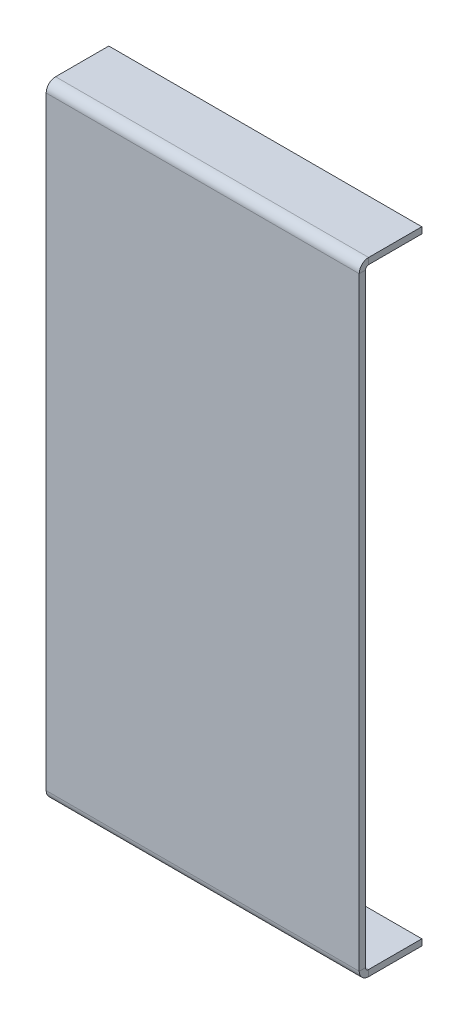
ISO-10303-21;
HEADER;
FILE_DESCRIPTION(('STEP AP214'),'2;1');
FILE_NAME('part.step','',(''),(''),'','','');
FILE_SCHEMA(('AUTOMOTIVE_DESIGN { 1 0 10303 214 1 1 1 1 }'));
ENDSEC;
DATA;
#1=APPLICATION_CONTEXT('core data for automotive mechanical design processes');
#2=APPLICATION_PROTOCOL_DEFINITION('international standard','automotive_design',2000,#1);
#3=PRODUCT_CONTEXT('',#1,'mechanical');
#4=PRODUCT('Part','Part','',(#3));
#5=PRODUCT_RELATED_PRODUCT_CATEGORY('part','',(#4));
#6=PRODUCT_DEFINITION_FORMATION('','',#4);
#7=PRODUCT_DEFINITION_CONTEXT('part definition',#1,'design');
#8=PRODUCT_DEFINITION('design','',#6,#7);
#9=PRODUCT_DEFINITION_SHAPE('','',#8);
#10=(LENGTH_UNIT() NAMED_UNIT(*) SI_UNIT(.MILLI.,.METRE.));
#11=(NAMED_UNIT(*) PLANE_ANGLE_UNIT() SI_UNIT($,.RADIAN.));
#12=(NAMED_UNIT(*) SI_UNIT($,.STERADIAN.) SOLID_ANGLE_UNIT());
#13=UNCERTAINTY_MEASURE_WITH_UNIT(LENGTH_MEASURE(1.E-05),#10,'distance_accuracy_value','');
#14=(GEOMETRIC_REPRESENTATION_CONTEXT(3) GLOBAL_UNCERTAINTY_ASSIGNED_CONTEXT((#13)) GLOBAL_UNIT_ASSIGNED_CONTEXT((#10,
#11,#12)) REPRESENTATION_CONTEXT('',''));
#15=CARTESIAN_POINT('',(0.,0.,0.));
#16=DIRECTION('',(0.,0.,1.));
#17=DIRECTION('',(1.,0.,0.));
#18=AXIS2_PLACEMENT_3D('',#15,#16,#17);
#19=CARTESIAN_POINT('',(0.,0.,-2.));
#20=DIRECTION('',(0.,0.,1.));
#21=DIRECTION('',(1.,0.,0.));
#22=AXIS2_PLACEMENT_3D('',#19,#20,#21);
#23=PLANE('',#22);
#24=DIRECTION('',(-1.,0.,0.));
#25=VECTOR('',#24,1.);
#26=CARTESIAN_POINT('',(-50.,-96.5,-2.00000000000001));
#27=LINE('',#26,#25);
#28=CARTESIAN_POINT('',(-50.,-96.5,-2.00000000000001));
#29=VERTEX_POINT('',#28);
#30=CARTESIAN_POINT('',(50.,-96.5,-2.00000000000001));
#31=VERTEX_POINT('',#30);
#32=EDGE_CURVE('E225',#29,#31,#27,.F.);
#33=ORIENTED_EDGE('',*,*,#32,.F.);
#34=DIRECTION('',(0.,-1.,0.));
#35=VECTOR('',#34,1.);
#36=CARTESIAN_POINT('',(-50.,99.5,-2.));
#37=LINE('',#36,#35);
#38=CARTESIAN_POINT('',(-50.,96.5,-2.00000000000001));
#39=VERTEX_POINT('',#38);
#40=EDGE_CURVE('E13',#39,#29,#37,.T.);
#41=ORIENTED_EDGE('',*,*,#40,.F.);
#42=DIRECTION('',(1.,0.,0.));
#43=VECTOR('',#42,1.);
#44=CARTESIAN_POINT('',(50.,96.5,-2.00000000000001));
#45=LINE('',#44,#43);
#46=CARTESIAN_POINT('',(50.,96.5,-2.00000000000001));
#47=VERTEX_POINT('',#46);
#48=EDGE_CURVE('E277',#47,#39,#45,.F.);
#49=ORIENTED_EDGE('',*,*,#48,.F.);
#50=DIRECTION('',(0.,1.,0.));
#51=VECTOR('',#50,1.);
#52=CARTESIAN_POINT('',(50.,99.5,-2.));
#53=LINE('',#52,#51);
#54=EDGE_CURVE('E88',#31,#47,#53,.T.);
#55=ORIENTED_EDGE('',*,*,#54,.F.);
#56=EDGE_LOOP('',(#33,#41,#49,#55));
#57=FACE_BOUND('',#56,.T.);
#58=ADVANCED_FACE('F79',(#57),#23,.F.);
#59=CARTESIAN_POINT('',(0.,0.,0.));
#60=DIRECTION('',(0.,0.,1.));
#61=DIRECTION('',(1.,0.,0.));
#62=AXIS2_PLACEMENT_3D('',#59,#60,#61);
#63=PLANE('',#62);
#64=DIRECTION('',(0.,-1.,0.));
#65=VECTOR('',#64,1.);
#66=CARTESIAN_POINT('',(-50.,99.5,0.));
#67=LINE('',#66,#65);
#68=CARTESIAN_POINT('',(-50.,96.5,0.));
#69=VERTEX_POINT('',#68);
#70=CARTESIAN_POINT('',(-50.,-96.5,0.));
#71=VERTEX_POINT('',#70);
#72=EDGE_CURVE('E83',#69,#71,#67,.T.);
#73=ORIENTED_EDGE('',*,*,#72,.T.);
#74=DIRECTION('',(-1.,0.,0.));
#75=VECTOR('',#74,1.);
#76=CARTESIAN_POINT('',(-50.,-96.5,0.));
#77=LINE('',#76,#75);
#78=CARTESIAN_POINT('',(50.,-96.5,0.));
#79=VERTEX_POINT('',#78);
#80=EDGE_CURVE('E214',#71,#79,#77,.F.);
#81=ORIENTED_EDGE('',*,*,#80,.T.);
#82=DIRECTION('',(0.,1.,0.));
#83=VECTOR('',#82,1.);
#84=CARTESIAN_POINT('',(50.,99.5,0.));
#85=LINE('',#84,#83);
#86=CARTESIAN_POINT('',(50.,96.5,0.));
#87=VERTEX_POINT('',#86);
#88=EDGE_CURVE('E283',#79,#87,#85,.T.);
#89=ORIENTED_EDGE('',*,*,#88,.T.);
#90=DIRECTION('',(1.,0.,0.));
#91=VECTOR('',#90,1.);
#92=CARTESIAN_POINT('',(50.,96.5,0.));
#93=LINE('',#92,#91);
#94=EDGE_CURVE('E266',#87,#69,#93,.F.);
#95=ORIENTED_EDGE('',*,*,#94,.T.);
#96=EDGE_LOOP('',(#73,#81,#89,#95));
#97=FACE_BOUND('',#96,.T.);
#98=ADVANCED_FACE('F292',(#97),#63,.T.);
#99=CARTESIAN_POINT('',(-50.,99.5,-2.));
#100=DIRECTION('',(-1.,0.,0.));
#101=DIRECTION('',(0.,-1.,0.));
#102=AXIS2_PLACEMENT_3D('',#99,#100,#101);
#103=PLANE('',#102);
#104=ORIENTED_EDGE('',*,*,#40,.T.);
#105=DIRECTION('',(0.,0.,1.));
#106=VECTOR('',#105,1.);
#107=CARTESIAN_POINT('',(-50.,-96.5,-2.00000000000001));
#108=LINE('',#107,#106);
#109=EDGE_CURVE('E219',#29,#71,#108,.T.);
#110=ORIENTED_EDGE('',*,*,#109,.T.);
#111=ORIENTED_EDGE('',*,*,#72,.F.);
#112=DIRECTION('',(0.,0.,1.));
#113=VECTOR('',#112,1.);
#114=CARTESIAN_POINT('',(-50.,96.5,-2.00000000000001));
#115=LINE('',#114,#113);
#116=EDGE_CURVE('E281',#39,#69,#115,.T.);
#117=ORIENTED_EDGE('',*,*,#116,.F.);
#118=EDGE_LOOP('',(#104,#110,#111,#117));
#119=FACE_BOUND('',#118,.T.);
#120=ADVANCED_FACE('F295',(#119),#103,.T.);
#121=CARTESIAN_POINT('',(50.,99.5,-2.));
#122=DIRECTION('',(1.,0.,0.));
#123=DIRECTION('',(0.,1.,0.));
#124=AXIS2_PLACEMENT_3D('',#121,#122,#123);
#125=PLANE('',#124);
#126=DIRECTION('',(0.,0.,1.));
#127=VECTOR('',#126,1.);
#128=CARTESIAN_POINT('',(50.,-96.5,-2.00000000000001));
#129=LINE('',#128,#127);
#130=EDGE_CURVE('E229',#31,#79,#129,.T.);
#131=ORIENTED_EDGE('',*,*,#130,.F.);
#132=ORIENTED_EDGE('',*,*,#54,.T.);
#133=DIRECTION('',(0.,0.,1.));
#134=VECTOR('',#133,1.);
#135=CARTESIAN_POINT('',(50.,96.5,-2.00000000000001));
#136=LINE('',#135,#134);
#137=EDGE_CURVE('E271',#47,#87,#136,.T.);
#138=ORIENTED_EDGE('',*,*,#137,.T.);
#139=ORIENTED_EDGE('',*,*,#88,.F.);
#140=EDGE_LOOP('',(#131,#132,#138,#139));
#141=FACE_BOUND('',#140,.T.);
#142=ADVANCED_FACE('F81',(#141),#125,.T.);
#143=CARTESIAN_POINT('',(-50.,96.5,-3.00000000000001));
#144=DIRECTION('',(-1.,0.,0.));
#145=DIRECTION('',(0.,0.,1.));
#146=AXIS2_PLACEMENT_3D('',#143,#144,#145);
#147=PLANE('',#146);
#148=DIRECTION('',(0.,1.,0.));
#149=VECTOR('',#148,1.);
#150=CARTESIAN_POINT('',(-50.,99.5,-3.));
#151=LINE('',#150,#149);
#152=CARTESIAN_POINT('',(-50.,97.5,-3.));
#153=VERTEX_POINT('',#152);
#154=CARTESIAN_POINT('',(-50.,99.5,-2.99999999999999));
#155=VERTEX_POINT('',#154);
#156=EDGE_CURVE('E231',#153,#155,#151,.T.);
#157=ORIENTED_EDGE('',*,*,#156,.F.);
#158=CARTESIAN_POINT('',(-50.,96.5,-3.00000000000001));
#159=DIRECTION('',(1.,0.,0.));
#160=DIRECTION('',(0.,0.,-1.));
#161=AXIS2_PLACEMENT_3D('',#158,#159,#160);
#162=CIRCLE('',#161,1.);
#163=EDGE_CURVE('E274',#39,#153,#162,.F.);
#164=ORIENTED_EDGE('',*,*,#163,.F.);
#165=ORIENTED_EDGE('',*,*,#116,.T.);
#166=CARTESIAN_POINT('',(-50.,96.5,-3.00000000000001));
#167=DIRECTION('',(1.,0.,0.));
#168=DIRECTION('',(0.,0.,-1.));
#169=AXIS2_PLACEMENT_3D('',#166,#167,#168);
#170=CIRCLE('',#169,3.);
#171=EDGE_CURVE('E96',#69,#155,#170,.F.);
#172=ORIENTED_EDGE('',*,*,#171,.T.);
#173=EDGE_LOOP('',(#157,#164,#165,#172));
#174=FACE_BOUND('',#173,.T.);
#175=ADVANCED_FACE('F341',(#174),#147,.T.);
#176=CARTESIAN_POINT('',(50.,96.5,-3.00000000000001));
#177=DIRECTION('',(-1.,0.,0.));
#178=DIRECTION('',(0.,0.,1.));
#179=AXIS2_PLACEMENT_3D('',#176,#177,#178);
#180=PLANE('',#179);
#181=CARTESIAN_POINT('',(50.,96.5,-3.00000000000001));
#182=DIRECTION('',(1.,0.,0.));
#183=DIRECTION('',(0.,0.,-1.));
#184=AXIS2_PLACEMENT_3D('',#181,#182,#183);
#185=CIRCLE('',#184,1.);
#186=CARTESIAN_POINT('',(50.,97.5,-3.));
#187=VERTEX_POINT('',#186);
#188=EDGE_CURVE('E236',#187,#47,#185,.T.);
#189=ORIENTED_EDGE('',*,*,#188,.F.);
#190=DIRECTION('',(0.,1.,0.));
#191=VECTOR('',#190,1.);
#192=CARTESIAN_POINT('',(50.,97.5,-3.));
#193=LINE('',#192,#191);
#194=CARTESIAN_POINT('',(50.,99.5,-2.99999999999999));
#195=VERTEX_POINT('',#194);
#196=EDGE_CURVE('E259',#187,#195,#193,.T.);
#197=ORIENTED_EDGE('',*,*,#196,.T.);
#198=CARTESIAN_POINT('',(50.,96.5,-3.00000000000001));
#199=DIRECTION('',(1.,0.,0.));
#200=DIRECTION('',(0.,0.,-1.));
#201=AXIS2_PLACEMENT_3D('',#198,#199,#200);
#202=CIRCLE('',#201,3.);
#203=EDGE_CURVE('E269',#195,#87,#202,.T.);
#204=ORIENTED_EDGE('',*,*,#203,.T.);
#205=ORIENTED_EDGE('',*,*,#137,.F.);
#206=EDGE_LOOP('',(#189,#197,#204,#205));
#207=FACE_BOUND('',#206,.T.);
#208=ADVANCED_FACE('F335',(#207),#180,.F.);
#209=CARTESIAN_POINT('',(50.,96.5,-3.00000000000001));
#210=DIRECTION('',(1.,0.,0.));
#211=DIRECTION('',(0.,1.,0.));
#212=AXIS2_PLACEMENT_3D('',#209,#210,#211);
#213=CYLINDRICAL_SURFACE('',#212,3.);
#214=ORIENTED_EDGE('',*,*,#94,.F.);
#215=ORIENTED_EDGE('',*,*,#203,.F.);
#216=DIRECTION('',(1.,0.,0.));
#217=VECTOR('',#216,1.);
#218=CARTESIAN_POINT('',(0.,99.5,-2.99999999999999));
#219=LINE('',#218,#217);
#220=EDGE_CURVE('E256',#155,#195,#219,.T.);
#221=ORIENTED_EDGE('',*,*,#220,.F.);
#222=ORIENTED_EDGE('',*,*,#171,.F.);
#223=EDGE_LOOP('',(#214,#215,#221,#222));
#224=FACE_BOUND('',#223,.T.);
#225=ADVANCED_FACE('F349',(#224),#213,.T.);
#226=CARTESIAN_POINT('',(50.,96.5,-3.00000000000001));
#227=DIRECTION('',(1.,0.,0.));
#228=DIRECTION('',(0.,1.,0.));
#229=AXIS2_PLACEMENT_3D('',#226,#227,#228);
#230=CYLINDRICAL_SURFACE('',#229,1.);
#231=ORIENTED_EDGE('',*,*,#48,.T.);
#232=ORIENTED_EDGE('',*,*,#163,.T.);
#233=DIRECTION('',(-1.,0.,0.));
#234=VECTOR('',#233,1.);
#235=CARTESIAN_POINT('',(-50.,97.5,-3.));
#236=LINE('',#235,#234);
#237=EDGE_CURVE('E262',#153,#187,#236,.F.);
#238=ORIENTED_EDGE('',*,*,#237,.T.);
#239=ORIENTED_EDGE('',*,*,#188,.T.);
#240=EDGE_LOOP('',(#231,#232,#238,#239));
#241=FACE_BOUND('',#240,.T.);
#242=ADVANCED_FACE('F352',(#241),#230,.F.);
#243=CARTESIAN_POINT('',(50.,99.5,-1.99999999999999));
#244=DIRECTION('',(1.,0.,0.));
#245=DIRECTION('',(0.,0.,-1.));
#246=AXIS2_PLACEMENT_3D('',#243,#244,#245);
#247=PLANE('',#246);
#248=DIRECTION('',(0.,0.,1.));
#249=VECTOR('',#248,1.);
#250=CARTESIAN_POINT('',(50.,99.5,-1.99999999999999));
#251=LINE('',#250,#249);
#252=CARTESIAN_POINT('',(50.,99.5000000000001,-20.));
#253=VERTEX_POINT('',#252);
#254=EDGE_CURVE('E240',#253,#195,#251,.T.);
#255=ORIENTED_EDGE('',*,*,#254,.T.);
#256=ORIENTED_EDGE('',*,*,#196,.F.);
#257=DIRECTION('',(0.,0.,-1.));
#258=VECTOR('',#257,1.);
#259=CARTESIAN_POINT('',(50.,97.5,3.83566635243761E-13));
#260=LINE('',#259,#258);
#261=CARTESIAN_POINT('',(50.,97.5000000000001,-20.));
#262=VERTEX_POINT('',#261);
#263=EDGE_CURVE('E248',#262,#187,#260,.F.);
#264=ORIENTED_EDGE('',*,*,#263,.F.);
#265=DIRECTION('',(0.,-1.,0.));
#266=VECTOR('',#265,1.);
#267=CARTESIAN_POINT('',(50.,99.5000000000001,-20.));
#268=LINE('',#267,#266);
#269=EDGE_CURVE('E234',#253,#262,#268,.T.);
#270=ORIENTED_EDGE('',*,*,#269,.F.);
#271=EDGE_LOOP('',(#255,#256,#264,#270));
#272=FACE_BOUND('',#271,.T.);
#273=ADVANCED_FACE('F355',(#272),#247,.T.);
#274=CARTESIAN_POINT('',(-50.,99.5000000000001,-20.));
#275=DIRECTION('',(-1.,0.,0.));
#276=DIRECTION('',(0.,0.,1.));
#277=AXIS2_PLACEMENT_3D('',#274,#275,#276);
#278=PLANE('',#277);
#279=DIRECTION('',(0.,0.,1.));
#280=VECTOR('',#279,1.);
#281=CARTESIAN_POINT('',(-50.,97.5,3.83566635243761E-13));
#282=LINE('',#281,#280);
#283=CARTESIAN_POINT('',(-50.,97.5000000000001,-20.));
#284=VERTEX_POINT('',#283);
#285=EDGE_CURVE('E254',#153,#284,#282,.F.);
#286=ORIENTED_EDGE('',*,*,#285,.F.);
#287=ORIENTED_EDGE('',*,*,#156,.T.);
#288=DIRECTION('',(0.,0.,-1.));
#289=VECTOR('',#288,1.);
#290=CARTESIAN_POINT('',(-50.,99.5000000000001,-20.));
#291=LINE('',#290,#289);
#292=CARTESIAN_POINT('',(-50.,99.5000000000001,-20.));
#293=VERTEX_POINT('',#292);
#294=EDGE_CURVE('E246',#155,#293,#291,.T.);
#295=ORIENTED_EDGE('',*,*,#294,.T.);
#296=DIRECTION('',(0.,-1.,0.));
#297=VECTOR('',#296,1.);
#298=CARTESIAN_POINT('',(-50.,99.5000000000001,-20.));
#299=LINE('',#298,#297);
#300=EDGE_CURVE('E237',#293,#284,#299,.T.);
#301=ORIENTED_EDGE('',*,*,#300,.T.);
#302=EDGE_LOOP('',(#286,#287,#295,#301));
#303=FACE_BOUND('',#302,.T.);
#304=ADVANCED_FACE('F359',(#303),#278,.T.);
#305=CARTESIAN_POINT('',(0.,99.5,3.90549597921447E-13));
#306=DIRECTION('',(0.,1.,0.));
#307=DIRECTION('',(0.,0.,1.));
#308=AXIS2_PLACEMENT_3D('',#305,#306,#307);
#309=PLANE('',#308);
#310=ORIENTED_EDGE('',*,*,#294,.F.);
#311=ORIENTED_EDGE('',*,*,#220,.T.);
#312=ORIENTED_EDGE('',*,*,#254,.F.);
#313=DIRECTION('',(1.,0.,0.));
#314=VECTOR('',#313,1.);
#315=CARTESIAN_POINT('',(50.,99.5000000000001,-20.));
#316=LINE('',#315,#314);
#317=EDGE_CURVE('E243',#293,#253,#316,.T.);
#318=ORIENTED_EDGE('',*,*,#317,.F.);
#319=EDGE_LOOP('',(#310,#311,#312,#318));
#320=FACE_BOUND('',#319,.T.);
#321=ADVANCED_FACE('F362',(#320),#309,.T.);
#322=CARTESIAN_POINT('',(0.,97.5,3.83566635243761E-13));
#323=DIRECTION('',(0.,1.,0.));
#324=DIRECTION('',(0.,0.,1.));
#325=AXIS2_PLACEMENT_3D('',#322,#323,#324);
#326=PLANE('',#325);
#327=ORIENTED_EDGE('',*,*,#237,.F.);
#328=ORIENTED_EDGE('',*,*,#285,.T.);
#329=DIRECTION('',(-1.,0.,0.));
#330=VECTOR('',#329,1.);
#331=CARTESIAN_POINT('',(0.,97.5000000000001,-20.));
#332=LINE('',#331,#330);
#333=EDGE_CURVE('E251',#284,#262,#332,.F.);
#334=ORIENTED_EDGE('',*,*,#333,.T.);
#335=ORIENTED_EDGE('',*,*,#263,.T.);
#336=EDGE_LOOP('',(#327,#328,#334,#335));
#337=FACE_BOUND('',#336,.T.);
#338=ADVANCED_FACE('F367',(#337),#326,.F.);
#339=CARTESIAN_POINT('',(50.,99.5000000000001,-20.));
#340=DIRECTION('',(0.,0.,-1.));
#341=DIRECTION('',(0.,1.,0.));
#342=AXIS2_PLACEMENT_3D('',#339,#340,#341);
#343=PLANE('',#342);
#344=ORIENTED_EDGE('',*,*,#333,.F.);
#345=ORIENTED_EDGE('',*,*,#300,.F.);
#346=ORIENTED_EDGE('',*,*,#317,.T.);
#347=ORIENTED_EDGE('',*,*,#269,.T.);
#348=EDGE_LOOP('',(#344,#345,#346,#347));
#349=FACE_BOUND('',#348,.T.);
#350=ADVANCED_FACE('F364',(#349),#343,.T.);
#351=CARTESIAN_POINT('',(50.,-96.5,-3.00000000000001));
#352=DIRECTION('',(1.,0.,0.));
#353=DIRECTION('',(0.,0.,-1.));
#354=AXIS2_PLACEMENT_3D('',#351,#352,#353);
#355=PLANE('',#354);
#356=DIRECTION('',(0.,-1.,0.));
#357=VECTOR('',#356,1.);
#358=CARTESIAN_POINT('',(50.,-99.5,-2.99999999999999));
#359=LINE('',#358,#357);
#360=CARTESIAN_POINT('',(50.,-97.5,-3.));
#361=VERTEX_POINT('',#360);
#362=CARTESIAN_POINT('',(50.,-99.5,-2.99999999999999));
#363=VERTEX_POINT('',#362);
#364=EDGE_CURVE('E211',#361,#363,#359,.T.);
#365=ORIENTED_EDGE('',*,*,#364,.F.);
#366=CARTESIAN_POINT('',(50.,-96.5,-3.00000000000001));
#367=DIRECTION('',(-1.,0.,0.));
#368=DIRECTION('',(0.,0.,1.));
#369=AXIS2_PLACEMENT_3D('',#366,#367,#368);
#370=CIRCLE('',#369,1.);
#371=EDGE_CURVE('E222',#31,#361,#370,.F.);
#372=ORIENTED_EDGE('',*,*,#371,.F.);
#373=ORIENTED_EDGE('',*,*,#130,.T.);
#374=CARTESIAN_POINT('',(50.,-96.5,-3.00000000000001));
#375=DIRECTION('',(-1.,0.,0.));
#376=DIRECTION('',(0.,0.,1.));
#377=AXIS2_PLACEMENT_3D('',#374,#375,#376);
#378=CIRCLE('',#377,3.);
#379=EDGE_CURVE('E104',#79,#363,#378,.F.);
#380=ORIENTED_EDGE('',*,*,#379,.T.);
#381=EDGE_LOOP('',(#365,#372,#373,#380));
#382=FACE_BOUND('',#381,.T.);
#383=ADVANCED_FACE('F311',(#382),#355,.T.);
#384=CARTESIAN_POINT('',(-50.,-96.5,-3.00000000000001));
#385=DIRECTION('',(1.,0.,0.));
#386=DIRECTION('',(0.,0.,-1.));
#387=AXIS2_PLACEMENT_3D('',#384,#385,#386);
#388=PLANE('',#387);
#389=CARTESIAN_POINT('',(-50.,-96.5,-3.00000000000001));
#390=DIRECTION('',(-1.,0.,0.));
#391=DIRECTION('',(0.,0.,1.));
#392=AXIS2_PLACEMENT_3D('',#389,#390,#391);
#393=CIRCLE('',#392,1.);
#394=CARTESIAN_POINT('',(-50.,-97.5,-3.));
#395=VERTEX_POINT('',#394);
#396=EDGE_CURVE('E181',#395,#29,#393,.T.);
#397=ORIENTED_EDGE('',*,*,#396,.F.);
#398=DIRECTION('',(0.,-1.,0.));
#399=VECTOR('',#398,1.);
#400=CARTESIAN_POINT('',(-50.,-97.5,-3.));
#401=LINE('',#400,#399);
#402=CARTESIAN_POINT('',(-50.,-99.5,-2.99999999999999));
#403=VERTEX_POINT('',#402);
#404=EDGE_CURVE('E206',#395,#403,#401,.T.);
#405=ORIENTED_EDGE('',*,*,#404,.T.);
#406=CARTESIAN_POINT('',(-50.,-96.5,-3.00000000000001));
#407=DIRECTION('',(-1.,0.,0.));
#408=DIRECTION('',(0.,0.,1.));
#409=AXIS2_PLACEMENT_3D('',#406,#407,#408);
#410=CIRCLE('',#409,3.);
#411=EDGE_CURVE('E217',#403,#71,#410,.T.);
#412=ORIENTED_EDGE('',*,*,#411,.T.);
#413=ORIENTED_EDGE('',*,*,#109,.F.);
#414=EDGE_LOOP('',(#397,#405,#412,#413));
#415=FACE_BOUND('',#414,.T.);
#416=ADVANCED_FACE('F299',(#415),#388,.F.);
#417=CARTESIAN_POINT('',(-50.,-96.5,-3.00000000000001));
#418=DIRECTION('',(-1.,0.,0.));
#419=DIRECTION('',(0.,-1.,0.));
#420=AXIS2_PLACEMENT_3D('',#417,#418,#419);
#421=CYLINDRICAL_SURFACE('',#420,3.);
#422=ORIENTED_EDGE('',*,*,#80,.F.);
#423=ORIENTED_EDGE('',*,*,#411,.F.);
#424=DIRECTION('',(-1.,0.,0.));
#425=VECTOR('',#424,1.);
#426=CARTESIAN_POINT('',(50.,-99.5,-2.99999999999999));
#427=LINE('',#426,#425);
#428=EDGE_CURVE('E190',#403,#363,#427,.F.);
#429=ORIENTED_EDGE('',*,*,#428,.T.);
#430=ORIENTED_EDGE('',*,*,#379,.F.);
#431=EDGE_LOOP('',(#422,#423,#429,#430));
#432=FACE_BOUND('',#431,.T.);
#433=ADVANCED_FACE('F324',(#432),#421,.T.);
#434=CARTESIAN_POINT('',(-50.,-96.5,-3.00000000000001));
#435=DIRECTION('',(-1.,0.,0.));
#436=DIRECTION('',(0.,-1.,0.));
#437=AXIS2_PLACEMENT_3D('',#434,#435,#436);
#438=CYLINDRICAL_SURFACE('',#437,1.);
#439=ORIENTED_EDGE('',*,*,#32,.T.);
#440=ORIENTED_EDGE('',*,*,#371,.T.);
#441=DIRECTION('',(-1.,0.,0.));
#442=VECTOR('',#441,1.);
#443=CARTESIAN_POINT('',(50.,-97.5,-3.));
#444=LINE('',#443,#442);
#445=EDGE_CURVE('E209',#361,#395,#444,.T.);
#446=ORIENTED_EDGE('',*,*,#445,.T.);
#447=ORIENTED_EDGE('',*,*,#396,.T.);
#448=EDGE_LOOP('',(#439,#440,#446,#447));
#449=FACE_BOUND('',#448,.T.);
#450=ADVANCED_FACE('F302',(#449),#438,.F.);
#451=CARTESIAN_POINT('',(50.,-99.5,-1.99999999999999));
#452=DIRECTION('',(1.,0.,0.));
#453=DIRECTION('',(0.,0.,-1.));
#454=AXIS2_PLACEMENT_3D('',#451,#452,#453);
#455=PLANE('',#454);
#456=DIRECTION('',(0.,0.,-1.));
#457=VECTOR('',#456,1.);
#458=CARTESIAN_POINT('',(50.,-97.5,3.8356663524376E-13));
#459=LINE('',#458,#457);
#460=CARTESIAN_POINT('',(50.,-97.5,-20.));
#461=VERTEX_POINT('',#460);
#462=EDGE_CURVE('E203',#361,#461,#459,.T.);
#463=ORIENTED_EDGE('',*,*,#462,.F.);
#464=ORIENTED_EDGE('',*,*,#364,.T.);
#465=DIRECTION('',(0.,0.,1.));
#466=VECTOR('',#465,1.);
#467=CARTESIAN_POINT('',(50.,-99.5,-1.99999999999999));
#468=LINE('',#467,#466);
#469=CARTESIAN_POINT('',(50.,-99.5,-20.));
#470=VERTEX_POINT('',#469);
#471=EDGE_CURVE('E195',#363,#470,#468,.F.);
#472=ORIENTED_EDGE('',*,*,#471,.T.);
#473=DIRECTION('',(0.,1.,0.));
#474=VECTOR('',#473,1.);
#475=CARTESIAN_POINT('',(50.,-99.5,-20.));
#476=LINE('',#475,#474);
#477=EDGE_CURVE('E182',#470,#461,#476,.T.);
#478=ORIENTED_EDGE('',*,*,#477,.T.);
#479=EDGE_LOOP('',(#463,#464,#472,#478));
#480=FACE_BOUND('',#479,.T.);
#481=ADVANCED_FACE('F316',(#480),#455,.T.);
#482=CARTESIAN_POINT('',(-50.,-99.5,-20.));
#483=DIRECTION('',(-1.,0.,0.));
#484=DIRECTION('',(0.,0.,1.));
#485=AXIS2_PLACEMENT_3D('',#482,#483,#484);
#486=PLANE('',#485);
#487=DIRECTION('',(0.,0.,-1.));
#488=VECTOR('',#487,1.);
#489=CARTESIAN_POINT('',(-50.,-99.5,-20.));
#490=LINE('',#489,#488);
#491=CARTESIAN_POINT('',(-50.,-99.5,-20.));
#492=VERTEX_POINT('',#491);
#493=EDGE_CURVE('E174',#492,#403,#490,.F.);
#494=ORIENTED_EDGE('',*,*,#493,.T.);
#495=ORIENTED_EDGE('',*,*,#404,.F.);
#496=DIRECTION('',(0.,0.,1.));
#497=VECTOR('',#496,1.);
#498=CARTESIAN_POINT('',(-50.,-97.5,3.8356663524376E-13));
#499=LINE('',#498,#497);
#500=CARTESIAN_POINT('',(-50.,-97.5,-20.));
#501=VERTEX_POINT('',#500);
#502=EDGE_CURVE('E176',#501,#395,#499,.T.);
#503=ORIENTED_EDGE('',*,*,#502,.F.);
#504=DIRECTION('',(0.,1.,0.));
#505=VECTOR('',#504,1.);
#506=CARTESIAN_POINT('',(-50.,-99.5,-20.));
#507=LINE('',#506,#505);
#508=EDGE_CURVE('E170',#492,#501,#507,.T.);
#509=ORIENTED_EDGE('',*,*,#508,.F.);
#510=EDGE_LOOP('',(#494,#495,#503,#509));
#511=FACE_BOUND('',#510,.T.);
#512=ADVANCED_FACE('F172',(#511),#486,.T.);
#513=CARTESIAN_POINT('',(0.,-99.5,3.90549597921447E-13));
#514=DIRECTION('',(0.,1.,0.));
#515=DIRECTION('',(0.,0.,1.));
#516=AXIS2_PLACEMENT_3D('',#513,#514,#515);
#517=PLANE('',#516);
#518=ORIENTED_EDGE('',*,*,#428,.F.);
#519=ORIENTED_EDGE('',*,*,#493,.F.);
#520=DIRECTION('',(1.,0.,0.));
#521=VECTOR('',#520,1.);
#522=CARTESIAN_POINT('',(50.,-99.5,-20.));
#523=LINE('',#522,#521);
#524=EDGE_CURVE('E189',#470,#492,#523,.F.);
#525=ORIENTED_EDGE('',*,*,#524,.F.);
#526=ORIENTED_EDGE('',*,*,#471,.F.);
#527=EDGE_LOOP('',(#518,#519,#525,#526));
#528=FACE_BOUND('',#527,.T.);
#529=ADVANCED_FACE('F187',(#528),#517,.F.);
#530=CARTESIAN_POINT('',(0.,-97.5,3.8356663524376E-13));
#531=DIRECTION('',(0.,1.,0.));
#532=DIRECTION('',(0.,0.,1.));
#533=AXIS2_PLACEMENT_3D('',#530,#531,#532);
#534=PLANE('',#533);
#535=ORIENTED_EDGE('',*,*,#502,.T.);
#536=ORIENTED_EDGE('',*,*,#445,.F.);
#537=ORIENTED_EDGE('',*,*,#462,.T.);
#538=DIRECTION('',(-1.,0.,0.));
#539=VECTOR('',#538,1.);
#540=CARTESIAN_POINT('',(0.,-97.5,-20.));
#541=LINE('',#540,#539);
#542=EDGE_CURVE('E201',#461,#501,#541,.T.);
#543=ORIENTED_EDGE('',*,*,#542,.T.);
#544=EDGE_LOOP('',(#535,#536,#537,#543));
#545=FACE_BOUND('',#544,.T.);
#546=ADVANCED_FACE('F314',(#545),#534,.T.);
#547=CARTESIAN_POINT('',(50.,-99.5,-20.));
#548=DIRECTION('',(0.,0.,-1.));
#549=DIRECTION('',(0.,1.,0.));
#550=AXIS2_PLACEMENT_3D('',#547,#548,#549);
#551=PLANE('',#550);
#552=ORIENTED_EDGE('',*,*,#542,.F.);
#553=ORIENTED_EDGE('',*,*,#477,.F.);
#554=ORIENTED_EDGE('',*,*,#524,.T.);
#555=ORIENTED_EDGE('',*,*,#508,.T.);
#556=EDGE_LOOP('',(#552,#553,#554,#555));
#557=FACE_BOUND('',#556,.T.);
#558=ADVANCED_FACE('F193',(#557),#551,.T.);
#559=CLOSED_SHELL('',(#58,#98,#120,#142,#175,#208,#225,#242,#273,#304,#321,#338,#350,#383,#416,
#433,#450,#481,#512,#529,#546,#558));
#560=MANIFOLD_SOLID_BREP('B2',#559);
#561=ADVANCED_BREP_SHAPE_REPRESENTATION('',(#18,#560),#14);
#562=SHAPE_DEFINITION_REPRESENTATION(#9,#561);
ENDSEC;
END-ISO-10303-21;
